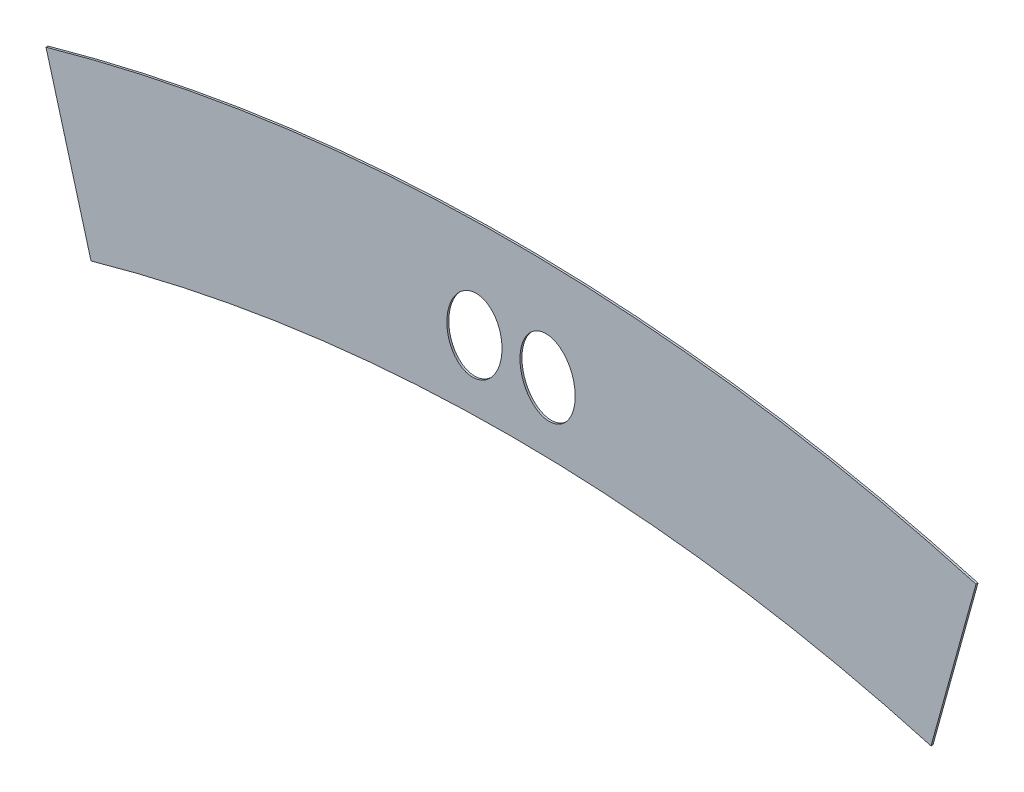
ISO-10303-21;
HEADER;
FILE_DESCRIPTION(('STEP AP214'),'2;1');
FILE_NAME('part.step','',(''),(''),'','','');
FILE_SCHEMA(('AUTOMOTIVE_DESIGN { 1 0 10303 214 1 1 1 1 }'));
ENDSEC;
DATA;
#1=APPLICATION_CONTEXT('core data for automotive mechanical design processes');
#2=APPLICATION_PROTOCOL_DEFINITION('international standard','automotive_design',2000,#1);
#3=PRODUCT_CONTEXT('',#1,'mechanical');
#4=PRODUCT('Part','Part','',(#3));
#5=PRODUCT_RELATED_PRODUCT_CATEGORY('part','',(#4));
#6=PRODUCT_DEFINITION_FORMATION('','',#4);
#7=PRODUCT_DEFINITION_CONTEXT('part definition',#1,'design');
#8=PRODUCT_DEFINITION('design','',#6,#7);
#9=PRODUCT_DEFINITION_SHAPE('','',#8);
#10=(LENGTH_UNIT() NAMED_UNIT(*) SI_UNIT(.MILLI.,.METRE.));
#11=(NAMED_UNIT(*) PLANE_ANGLE_UNIT() SI_UNIT($,.RADIAN.));
#12=(NAMED_UNIT(*) SI_UNIT($,.STERADIAN.) SOLID_ANGLE_UNIT());
#13=UNCERTAINTY_MEASURE_WITH_UNIT(LENGTH_MEASURE(1.E-05),#10,'distance_accuracy_value','');
#14=(GEOMETRIC_REPRESENTATION_CONTEXT(3) GLOBAL_UNCERTAINTY_ASSIGNED_CONTEXT((#13)) GLOBAL_UNIT_ASSIGNED_CONTEXT((#10,
#11,#12)) REPRESENTATION_CONTEXT('',''));
#15=CARTESIAN_POINT('',(0.,0.,0.));
#16=DIRECTION('',(0.,0.,1.));
#17=DIRECTION('',(1.,0.,0.));
#18=AXIS2_PLACEMENT_3D('',#15,#16,#17);
#19=CARTESIAN_POINT('',(8.46483731497876E-13,-2764.917,-3.175));
#20=DIRECTION('',(0.,0.,1.));
#21=DIRECTION('',(1.,0.,0.));
#22=AXIS2_PLACEMENT_3D('',#19,#20,#21);
#23=CYLINDRICAL_SURFACE('',#22,2764.917);
#24=CARTESIAN_POINT('',(8.46483731497876E-13,-2764.917,0.));
#25=DIRECTION('',(0.,0.,1.));
#26=DIRECTION('',(1.,0.,0.));
#27=AXIS2_PLACEMENT_3D('',#24,#25,#26);
#28=CIRCLE('',#27,2764.917);
#29=CARTESIAN_POINT('',(752.475,-104.363036769034,0.));
#30=VERTEX_POINT('',#29);
#31=CARTESIAN_POINT('',(-752.475,-104.363036769034,0.));
#32=VERTEX_POINT('',#31);
#33=EDGE_CURVE('E74',#30,#32,#28,.T.);
#34=ORIENTED_EDGE('',*,*,#33,.F.);
#35=DIRECTION('',(0.,0.,1.));
#36=VECTOR('',#35,1.);
#37=CARTESIAN_POINT('',(752.475,-104.363036769034,-3.175));
#38=LINE('',#37,#36);
#39=CARTESIAN_POINT('',(752.475,-104.363036769034,-3.175));
#40=VERTEX_POINT('',#39);
#41=EDGE_CURVE('E11',#40,#30,#38,.T.);
#42=ORIENTED_EDGE('',*,*,#41,.F.);
#43=CARTESIAN_POINT('',(8.46483731497876E-13,-2764.917,-3.175));
#44=DIRECTION('',(0.,0.,1.));
#45=DIRECTION('',(1.,0.,0.));
#46=AXIS2_PLACEMENT_3D('',#43,#44,#45);
#47=CIRCLE('',#46,2764.917);
#48=CARTESIAN_POINT('',(-752.475,-104.363036769034,-3.175));
#49=VERTEX_POINT('',#48);
#50=EDGE_CURVE('E76',#40,#49,#47,.T.);
#51=ORIENTED_EDGE('',*,*,#50,.T.);
#52=DIRECTION('',(0.,0.,1.));
#53=VECTOR('',#52,1.);
#54=CARTESIAN_POINT('',(-752.475,-104.363036769034,-3.175));
#55=LINE('',#54,#53);
#56=EDGE_CURVE('E37',#49,#32,#55,.T.);
#57=ORIENTED_EDGE('',*,*,#56,.T.);
#58=EDGE_LOOP('',(#34,#42,#51,#57));
#59=FACE_BOUND('',#58,.T.);
#60=ADVANCED_FACE('F34',(#59),#23,.T.);
#61=CARTESIAN_POINT('',(752.475,-104.363036769034,-3.175));
#62=DIRECTION('',(0.963755765086603,-0.266786103952841,0.));
#63=DIRECTION('',(0.266786103952841,0.963755765086603,0.));
#64=AXIS2_PLACEMENT_3D('',#61,#62,#63);
#65=PLANE('',#64);
#66=DIRECTION('',(0.26678610395284,0.963755765086603,0.));
#67=VECTOR('',#66,1.);
#68=CARTESIAN_POINT('',(752.475,-104.363036769034,0.));
#69=LINE('',#68,#67);
#70=CARTESIAN_POINT('',(679.6278,-367.521079598833,0.));
#71=VERTEX_POINT('',#70);
#72=EDGE_CURVE('E91',#71,#30,#69,.T.);
#73=ORIENTED_EDGE('',*,*,#72,.F.);
#74=DIRECTION('',(0.,0.,1.));
#75=VECTOR('',#74,1.);
#76=CARTESIAN_POINT('',(679.6278,-367.521079598833,-3.175));
#77=LINE('',#76,#75);
#78=CARTESIAN_POINT('',(679.6278,-367.521079598833,-3.175));
#79=VERTEX_POINT('',#78);
#80=EDGE_CURVE('E42',#79,#71,#77,.T.);
#81=ORIENTED_EDGE('',*,*,#80,.F.);
#82=DIRECTION('',(0.26678610395284,0.963755765086603,0.));
#83=VECTOR('',#82,1.);
#84=CARTESIAN_POINT('',(752.475,-104.363036769034,-3.175));
#85=LINE('',#84,#83);
#86=EDGE_CURVE('E81',#79,#40,#85,.T.);
#87=ORIENTED_EDGE('',*,*,#86,.T.);
#88=ORIENTED_EDGE('',*,*,#41,.T.);
#89=EDGE_LOOP('',(#73,#81,#87,#88));
#90=FACE_BOUND('',#89,.T.);
#91=ADVANCED_FACE('F112',(#90),#65,.T.);
#92=CARTESIAN_POINT('',(8.46483731497876E-13,-2764.917,-3.175));
#93=DIRECTION('',(0.,0.,1.));
#94=DIRECTION('',(1.,0.,0.));
#95=AXIS2_PLACEMENT_3D('',#92,#93,#94);
#96=CYLINDRICAL_SURFACE('',#95,2491.867);
#97=CARTESIAN_POINT('',(8.46483731497876E-13,-2764.917,0.));
#98=DIRECTION('',(0.,0.,-1.));
#99=DIRECTION('',(1.,0.,0.));
#100=AXIS2_PLACEMENT_3D('',#97,#98,#99);
#101=CIRCLE('',#100,2491.867);
#102=CARTESIAN_POINT('',(-679.6278,-367.521079598833,0.));
#103=VERTEX_POINT('',#102);
#104=EDGE_CURVE('E88',#103,#71,#101,.T.);
#105=ORIENTED_EDGE('',*,*,#104,.F.);
#106=DIRECTION('',(0.,0.,1.));
#107=VECTOR('',#106,1.);
#108=CARTESIAN_POINT('',(-679.6278,-367.521079598833,-3.175));
#109=LINE('',#108,#107);
#110=CARTESIAN_POINT('',(-679.6278,-367.521079598833,-3.175));
#111=VERTEX_POINT('',#110);
#112=EDGE_CURVE('E80',#111,#103,#109,.T.);
#113=ORIENTED_EDGE('',*,*,#112,.F.);
#114=CARTESIAN_POINT('',(8.46483731497876E-13,-2764.917,-3.175));
#115=DIRECTION('',(0.,0.,-1.));
#116=DIRECTION('',(1.,0.,0.));
#117=AXIS2_PLACEMENT_3D('',#114,#115,#116);
#118=CIRCLE('',#117,2491.867);
#119=EDGE_CURVE('E105',#111,#79,#118,.T.);
#120=ORIENTED_EDGE('',*,*,#119,.T.);
#121=ORIENTED_EDGE('',*,*,#80,.T.);
#122=EDGE_LOOP('',(#105,#113,#120,#121));
#123=FACE_BOUND('',#122,.T.);
#124=ADVANCED_FACE('F109',(#123),#96,.F.);
#125=CARTESIAN_POINT('',(-752.475,-104.363036769034,-3.175));
#126=DIRECTION('',(-0.963755765086603,-0.266786103952841,0.));
#127=DIRECTION('',(0.266786103952841,-0.963755765086603,0.));
#128=AXIS2_PLACEMENT_3D('',#125,#126,#127);
#129=PLANE('',#128);
#130=DIRECTION('',(0.266786103952841,-0.963755765086603,0.));
#131=VECTOR('',#130,1.);
#132=CARTESIAN_POINT('',(-752.475,-104.363036769034,0.));
#133=LINE('',#132,#131);
#134=EDGE_CURVE('E83',#32,#103,#133,.T.);
#135=ORIENTED_EDGE('',*,*,#134,.F.);
#136=ORIENTED_EDGE('',*,*,#56,.F.);
#137=DIRECTION('',(0.266786103952841,-0.963755765086603,0.));
#138=VECTOR('',#137,1.);
#139=CARTESIAN_POINT('',(-752.475,-104.363036769034,-3.175));
#140=LINE('',#139,#138);
#141=EDGE_CURVE('E103',#49,#111,#140,.T.);
#142=ORIENTED_EDGE('',*,*,#141,.T.);
#143=ORIENTED_EDGE('',*,*,#112,.T.);
#144=EDGE_LOOP('',(#135,#136,#142,#143));
#145=FACE_BOUND('',#144,.T.);
#146=ADVANCED_FACE('F84',(#145),#129,.T.);
#147=CARTESIAN_POINT('',(8.46483731497876E-13,-2764.917,-3.175));
#148=DIRECTION('',(0.,0.,1.));
#149=DIRECTION('',(1.,0.,0.));
#150=AXIS2_PLACEMENT_3D('',#147,#148,#149);
#151=PLANE('',#150);
#152=CARTESIAN_POINT('',(59.1979241058823,-161.431165365643,-3.175));
#153=DIRECTION('',(0.,0.,1.));
#154=DIRECTION('',(0.100882656204318,-0.994898331326956,0.));
#155=AXIS2_PLACEMENT_3D('',#152,#153,#154);
#156=ELLIPSE('',#155,60.325,44.4500000000001);
#157=CARTESIAN_POINT('',(65.2836703414078,-221.448407202942,-3.175));
#158=VERTEX_POINT('',#157);
#159=EDGE_CURVE('E178',#158,#158,#156,.T.);
#160=ORIENTED_EDGE('',*,*,#159,.T.);
#161=EDGE_LOOP('',(#160));
#162=FACE_BOUND('',#161,.T.);
#163=CARTESIAN_POINT('',(-59.1979241058823,-161.431165365643,-3.175));
#164=DIRECTION('',(0.,0.,1.));
#165=DIRECTION('',(-0.100882656204318,-0.994898331326956,0.));
#166=AXIS2_PLACEMENT_3D('',#163,#164,#165);
#167=ELLIPSE('',#166,60.325,44.45);
#168=CARTESIAN_POINT('',(-65.2836703414077,-221.448407202942,-3.175));
#169=VERTEX_POINT('',#168);
#170=EDGE_CURVE('E92',#169,#169,#167,.T.);
#171=ORIENTED_EDGE('',*,*,#170,.T.);
#172=EDGE_LOOP('',(#171));
#173=FACE_BOUND('',#172,.T.);
#174=ORIENTED_EDGE('',*,*,#50,.F.);
#175=ORIENTED_EDGE('',*,*,#86,.F.);
#176=ORIENTED_EDGE('',*,*,#119,.F.);
#177=ORIENTED_EDGE('',*,*,#141,.F.);
#178=EDGE_LOOP('',(#174,#175,#176,#177));
#179=FACE_BOUND('',#178,.T.);
#180=ADVANCED_FACE('F114',(#162,#173,#179),#151,.F.);
#181=CARTESIAN_POINT('',(8.46483731497876E-13,-2764.917,0.));
#182=DIRECTION('',(0.,0.,1.));
#183=DIRECTION('',(1.,0.,0.));
#184=AXIS2_PLACEMENT_3D('',#181,#182,#183);
#185=PLANE('',#184);
#186=CARTESIAN_POINT('',(59.1979241058823,-161.431165365643,0.));
#187=DIRECTION('',(0.,0.,1.));
#188=DIRECTION('',(0.100882656204318,-0.994898331326956,0.));
#189=AXIS2_PLACEMENT_3D('',#186,#187,#188);
#190=ELLIPSE('',#189,60.325,44.4500000000001);
#191=CARTESIAN_POINT('',(65.2836703414078,-221.448407202942,0.));
#192=VERTEX_POINT('',#191);
#193=EDGE_CURVE('E181',#192,#192,#190,.T.);
#194=ORIENTED_EDGE('',*,*,#193,.F.);
#195=EDGE_LOOP('',(#194));
#196=FACE_BOUND('',#195,.T.);
#197=CARTESIAN_POINT('',(-59.1979241058823,-161.431165365643,0.));
#198=DIRECTION('',(0.,0.,1.));
#199=DIRECTION('',(-0.100882656204318,-0.994898331326956,0.));
#200=AXIS2_PLACEMENT_3D('',#197,#198,#199);
#201=ELLIPSE('',#200,60.325,44.45);
#202=CARTESIAN_POINT('',(-65.2836703414077,-221.448407202942,0.));
#203=VERTEX_POINT('',#202);
#204=EDGE_CURVE('E95',#203,#203,#201,.T.);
#205=ORIENTED_EDGE('',*,*,#204,.F.);
#206=EDGE_LOOP('',(#205));
#207=FACE_BOUND('',#206,.T.);
#208=ORIENTED_EDGE('',*,*,#33,.T.);
#209=ORIENTED_EDGE('',*,*,#134,.T.);
#210=ORIENTED_EDGE('',*,*,#104,.T.);
#211=ORIENTED_EDGE('',*,*,#72,.T.);
#212=EDGE_LOOP('',(#208,#209,#210,#211));
#213=FACE_BOUND('',#212,.T.);
#214=ADVANCED_FACE('F90',(#196,#207,#213),#185,.T.);
#215=DIRECTION('',(0.,0.,1.));
#216=VECTOR('',#215,1.);
#217=SURFACE_OF_LINEAR_EXTRUSION('',#167,#216);
#218=ORIENTED_EDGE('',*,*,#170,.F.);
#219=EDGE_LOOP('',(#218));
#220=FACE_BOUND('',#219,.T.);
#221=ORIENTED_EDGE('',*,*,#204,.T.);
#222=EDGE_LOOP('',(#221));
#223=FACE_BOUND('',#222,.T.);
#224=ADVANCED_FACE('F122',(#220,#223),#217,.F.);
#225=DIRECTION('',(0.,0.,1.));
#226=VECTOR('',#225,1.);
#227=SURFACE_OF_LINEAR_EXTRUSION('',#156,#226);
#228=ORIENTED_EDGE('',*,*,#159,.F.);
#229=EDGE_LOOP('',(#228));
#230=FACE_BOUND('',#229,.T.);
#231=ORIENTED_EDGE('',*,*,#193,.T.);
#232=EDGE_LOOP('',(#231));
#233=FACE_BOUND('',#232,.T.);
#234=ADVANCED_FACE('F161',(#230,#233),#227,.F.);
#235=CLOSED_SHELL('',(#60,#91,#124,#146,#180,#214,#224,#234));
#236=MANIFOLD_SOLID_BREP('B2',#235);
#237=ADVANCED_BREP_SHAPE_REPRESENTATION('',(#18,#236),#14);
#238=SHAPE_DEFINITION_REPRESENTATION(#9,#237);
ENDSEC;
END-ISO-10303-21;
